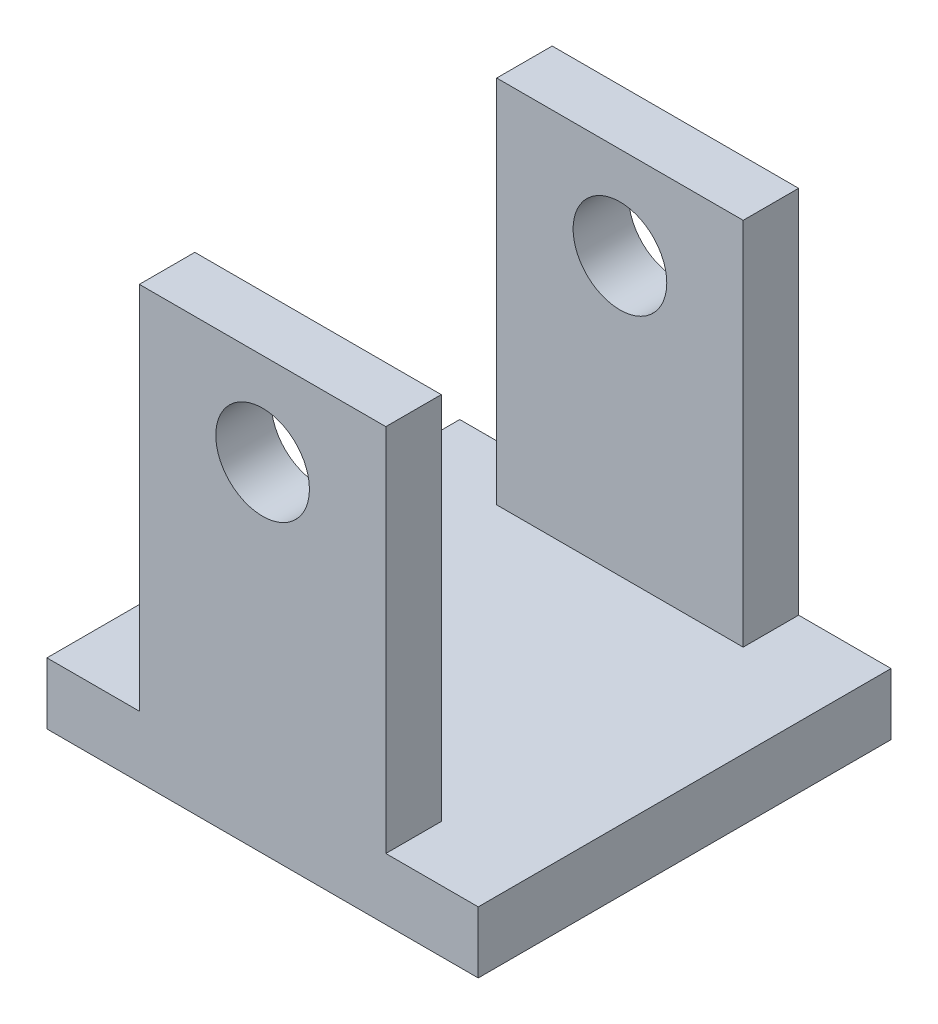
ISO-10303-21;
HEADER;
FILE_DESCRIPTION(('STEP AP214'),'2;1');
FILE_NAME('part.step','',(''),(''),'','','');
FILE_SCHEMA(('AUTOMOTIVE_DESIGN { 1 0 10303 214 1 1 1 1 }'));
ENDSEC;
DATA;
#1=APPLICATION_CONTEXT('core data for automotive mechanical design processes');
#2=APPLICATION_PROTOCOL_DEFINITION('international standard','automotive_design',2000,#1);
#3=PRODUCT_CONTEXT('',#1,'mechanical');
#4=PRODUCT('Part','Part','',(#3));
#5=PRODUCT_RELATED_PRODUCT_CATEGORY('part','',(#4));
#6=PRODUCT_DEFINITION_FORMATION('','',#4);
#7=PRODUCT_DEFINITION_CONTEXT('part definition',#1,'design');
#8=PRODUCT_DEFINITION('design','',#6,#7);
#9=PRODUCT_DEFINITION_SHAPE('','',#8);
#10=(LENGTH_UNIT() NAMED_UNIT(*) SI_UNIT(.MILLI.,.METRE.));
#11=(NAMED_UNIT(*) PLANE_ANGLE_UNIT() SI_UNIT($,.RADIAN.));
#12=(NAMED_UNIT(*) SI_UNIT($,.STERADIAN.) SOLID_ANGLE_UNIT());
#13=UNCERTAINTY_MEASURE_WITH_UNIT(LENGTH_MEASURE(1.E-05),#10,'distance_accuracy_value','');
#14=(GEOMETRIC_REPRESENTATION_CONTEXT(3) GLOBAL_UNCERTAINTY_ASSIGNED_CONTEXT((#13)) GLOBAL_UNIT_ASSIGNED_CONTEXT((#10,
#11,#12)) REPRESENTATION_CONTEXT('',''));
#15=CARTESIAN_POINT('',(0.,0.,0.));
#16=DIRECTION('',(0.,0.,1.));
#17=DIRECTION('',(1.,0.,0.));
#18=AXIS2_PLACEMENT_3D('',#15,#16,#17);
#19=CARTESIAN_POINT('',(-20.,15.,33.5));
#20=DIRECTION('',(1.,0.,0.));
#21=DIRECTION('',(0.,1.,0.));
#22=AXIS2_PLACEMENT_3D('',#19,#20,#21);
#23=PLANE('',#22);
#24=DIRECTION('',(0.,-1.,0.));
#25=VECTOR('',#24,1.);
#26=CARTESIAN_POINT('',(-20.,15.,-24.5));
#27=LINE('',#26,#25);
#28=CARTESIAN_POINT('',(-20.,15.,-24.5));
#29=VERTEX_POINT('',#28);
#30=CARTESIAN_POINT('',(-20.,-45.,-24.5));
#31=VERTEX_POINT('',#30);
#32=EDGE_CURVE('E142',#29,#31,#27,.T.);
#33=ORIENTED_EDGE('',*,*,#32,.F.);
#34=DIRECTION('',(0.,0.,-1.));
#35=VECTOR('',#34,1.);
#36=CARTESIAN_POINT('',(-20.,15.,33.5));
#37=LINE('',#36,#35);
#38=CARTESIAN_POINT('',(-20.,15.,-33.5));
#39=VERTEX_POINT('',#38);
#40=EDGE_CURVE('E269',#29,#39,#37,.T.);
#41=ORIENTED_EDGE('',*,*,#40,.T.);
#42=DIRECTION('',(0.,-1.,0.));
#43=VECTOR('',#42,1.);
#44=CARTESIAN_POINT('',(-20.,15.,-33.5));
#45=LINE('',#44,#43);
#46=CARTESIAN_POINT('',(-20.,-45.,-33.5));
#47=VERTEX_POINT('',#46);
#48=EDGE_CURVE('E154',#39,#47,#45,.T.);
#49=ORIENTED_EDGE('',*,*,#48,.T.);
#50=DIRECTION('',(0.,0.,-1.));
#51=VECTOR('',#50,1.);
#52=CARTESIAN_POINT('',(-20.,-45.,33.5));
#53=LINE('',#52,#51);
#54=EDGE_CURVE('E68',#31,#47,#53,.T.);
#55=ORIENTED_EDGE('',*,*,#54,.F.);
#56=EDGE_LOOP('',(#33,#41,#49,#55));
#57=FACE_BOUND('',#56,.T.);
#58=ADVANCED_FACE('F43',(#57),#23,.F.);
#59=CARTESIAN_POINT('',(20.,15.,33.5));
#60=DIRECTION('',(-1.,0.,0.));
#61=DIRECTION('',(0.,-1.,0.));
#62=AXIS2_PLACEMENT_3D('',#59,#60,#61);
#63=PLANE('',#62);
#64=DIRECTION('',(0.,1.,0.));
#65=VECTOR('',#64,1.);
#66=CARTESIAN_POINT('',(20.,15.,-24.5));
#67=LINE('',#66,#65);
#68=CARTESIAN_POINT('',(20.,-45.,-24.5));
#69=VERTEX_POINT('',#68);
#70=CARTESIAN_POINT('',(20.,15.,-24.5));
#71=VERTEX_POINT('',#70);
#72=EDGE_CURVE('E141',#69,#71,#67,.T.);
#73=ORIENTED_EDGE('',*,*,#72,.F.);
#74=DIRECTION('',(0.,0.,-1.));
#75=VECTOR('',#74,1.);
#76=CARTESIAN_POINT('',(20.,-45.,33.5));
#77=LINE('',#76,#75);
#78=CARTESIAN_POINT('',(20.,-45.,-33.5));
#79=VERTEX_POINT('',#78);
#80=EDGE_CURVE('E137',#69,#79,#77,.T.);
#81=ORIENTED_EDGE('',*,*,#80,.T.);
#82=DIRECTION('',(0.,1.,0.));
#83=VECTOR('',#82,1.);
#84=CARTESIAN_POINT('',(20.,15.,-33.5));
#85=LINE('',#84,#83);
#86=CARTESIAN_POINT('',(20.,15.,-33.5));
#87=VERTEX_POINT('',#86);
#88=EDGE_CURVE('E220',#79,#87,#85,.T.);
#89=ORIENTED_EDGE('',*,*,#88,.T.);
#90=DIRECTION('',(0.,0.,-1.));
#91=VECTOR('',#90,1.);
#92=CARTESIAN_POINT('',(20.,15.,33.5));
#93=LINE('',#92,#91);
#94=EDGE_CURVE('E278',#71,#87,#93,.T.);
#95=ORIENTED_EDGE('',*,*,#94,.F.);
#96=EDGE_LOOP('',(#73,#81,#89,#95));
#97=FACE_BOUND('',#96,.T.);
#98=ADVANCED_FACE('F290',(#97),#63,.F.);
#99=CARTESIAN_POINT('',(-20.,15.,33.5));
#100=DIRECTION('',(0.,-1.,0.));
#101=DIRECTION('',(1.,0.,0.));
#102=AXIS2_PLACEMENT_3D('',#99,#100,#101);
#103=PLANE('',#102);
#104=DIRECTION('',(-1.,0.,0.));
#105=VECTOR('',#104,1.);
#106=CARTESIAN_POINT('',(-20.,15.,-24.5));
#107=LINE('',#106,#105);
#108=EDGE_CURVE('E147',#71,#29,#107,.T.);
#109=ORIENTED_EDGE('',*,*,#108,.F.);
#110=ORIENTED_EDGE('',*,*,#94,.T.);
#111=DIRECTION('',(-1.,0.,0.));
#112=VECTOR('',#111,1.);
#113=CARTESIAN_POINT('',(-20.,15.,-33.5));
#114=LINE('',#113,#112);
#115=EDGE_CURVE('E263',#87,#39,#114,.T.);
#116=ORIENTED_EDGE('',*,*,#115,.T.);
#117=ORIENTED_EDGE('',*,*,#40,.F.);
#118=EDGE_LOOP('',(#109,#110,#116,#117));
#119=FACE_BOUND('',#118,.T.);
#120=ADVANCED_FACE('F288',(#119),#103,.F.);
#121=CARTESIAN_POINT('',(-35.,-45.,33.5));
#122=DIRECTION('',(1.,0.,0.));
#123=DIRECTION('',(0.,1.,0.));
#124=AXIS2_PLACEMENT_3D('',#121,#122,#123);
#125=PLANE('',#124);
#126=DIRECTION('',(0.,-1.,0.));
#127=VECTOR('',#126,1.);
#128=CARTESIAN_POINT('',(-35.,-45.,-33.5));
#129=LINE('',#128,#127);
#130=CARTESIAN_POINT('',(-35.,-45.,-33.5));
#131=VERTEX_POINT('',#130);
#132=CARTESIAN_POINT('',(-35.,-55.,-33.5));
#133=VERTEX_POINT('',#132);
#134=EDGE_CURVE('E163',#131,#133,#129,.T.);
#135=ORIENTED_EDGE('',*,*,#134,.T.);
#136=DIRECTION('',(0.,0.,-1.));
#137=VECTOR('',#136,1.);
#138=CARTESIAN_POINT('',(-35.,-55.,33.5));
#139=LINE('',#138,#137);
#140=CARTESIAN_POINT('',(-35.,-55.,33.5));
#141=VERTEX_POINT('',#140);
#142=EDGE_CURVE('E11',#141,#133,#139,.T.);
#143=ORIENTED_EDGE('',*,*,#142,.F.);
#144=DIRECTION('',(0.,-1.,0.));
#145=VECTOR('',#144,1.);
#146=CARTESIAN_POINT('',(-35.,-45.,33.5));
#147=LINE('',#146,#145);
#148=CARTESIAN_POINT('',(-35.,-45.,33.5));
#149=VERTEX_POINT('',#148);
#150=EDGE_CURVE('E168',#149,#141,#147,.T.);
#151=ORIENTED_EDGE('',*,*,#150,.F.);
#152=DIRECTION('',(0.,0.,-1.));
#153=VECTOR('',#152,1.);
#154=CARTESIAN_POINT('',(-35.,-45.,33.5));
#155=LINE('',#154,#153);
#156=EDGE_CURVE('E184',#149,#131,#155,.T.);
#157=ORIENTED_EDGE('',*,*,#156,.T.);
#158=EDGE_LOOP('',(#135,#143,#151,#157));
#159=FACE_BOUND('',#158,.T.);
#160=ADVANCED_FACE('F45',(#159),#125,.F.);
#161=CARTESIAN_POINT('',(-35.,-55.,33.5));
#162=DIRECTION('',(0.,1.,0.));
#163=DIRECTION('',(-1.,0.,0.));
#164=AXIS2_PLACEMENT_3D('',#161,#162,#163);
#165=PLANE('',#164);
#166=DIRECTION('',(1.,0.,0.));
#167=VECTOR('',#166,1.);
#168=CARTESIAN_POINT('',(-35.,-55.,-33.5));
#169=LINE('',#168,#167);
#170=CARTESIAN_POINT('',(35.,-55.,-33.5));
#171=VERTEX_POINT('',#170);
#172=EDGE_CURVE('E188',#133,#171,#169,.T.);
#173=ORIENTED_EDGE('',*,*,#172,.T.);
#174=DIRECTION('',(0.,0.,-1.));
#175=VECTOR('',#174,1.);
#176=CARTESIAN_POINT('',(35.,-55.,33.5));
#177=LINE('',#176,#175);
#178=CARTESIAN_POINT('',(35.,-55.,33.5));
#179=VERTEX_POINT('',#178);
#180=EDGE_CURVE('E53',#179,#171,#177,.T.);
#181=ORIENTED_EDGE('',*,*,#180,.F.);
#182=DIRECTION('',(1.,0.,0.));
#183=VECTOR('',#182,1.);
#184=CARTESIAN_POINT('',(-35.,-55.,33.5));
#185=LINE('',#184,#183);
#186=EDGE_CURVE('E172',#141,#179,#185,.T.);
#187=ORIENTED_EDGE('',*,*,#186,.F.);
#188=ORIENTED_EDGE('',*,*,#142,.T.);
#189=EDGE_LOOP('',(#173,#181,#187,#188));
#190=FACE_BOUND('',#189,.T.);
#191=ADVANCED_FACE('F230',(#190),#165,.F.);
#192=CARTESIAN_POINT('',(35.,-45.,33.5));
#193=DIRECTION('',(-1.,0.,0.));
#194=DIRECTION('',(0.,0.,1.));
#195=AXIS2_PLACEMENT_3D('',#192,#193,#194);
#196=PLANE('',#195);
#197=DIRECTION('',(0.,1.,0.));
#198=VECTOR('',#197,1.);
#199=CARTESIAN_POINT('',(35.,-45.,-33.5));
#200=LINE('',#199,#198);
#201=CARTESIAN_POINT('',(35.,-45.,-33.5));
#202=VERTEX_POINT('',#201);
#203=EDGE_CURVE('E191',#171,#202,#200,.T.);
#204=ORIENTED_EDGE('',*,*,#203,.T.);
#205=DIRECTION('',(0.,0.,-1.));
#206=VECTOR('',#205,1.);
#207=CARTESIAN_POINT('',(35.,-45.,33.5));
#208=LINE('',#207,#206);
#209=CARTESIAN_POINT('',(35.,-45.,33.5));
#210=VERTEX_POINT('',#209);
#211=EDGE_CURVE('E200',#210,#202,#208,.T.);
#212=ORIENTED_EDGE('',*,*,#211,.F.);
#213=DIRECTION('',(0.,1.,0.));
#214=VECTOR('',#213,1.);
#215=CARTESIAN_POINT('',(35.,-45.,33.5));
#216=LINE('',#215,#214);
#217=EDGE_CURVE('E176',#179,#210,#216,.T.);
#218=ORIENTED_EDGE('',*,*,#217,.F.);
#219=ORIENTED_EDGE('',*,*,#180,.T.);
#220=EDGE_LOOP('',(#204,#212,#218,#219));
#221=FACE_BOUND('',#220,.T.);
#222=ADVANCED_FACE('F210',(#221),#196,.F.);
#223=CARTESIAN_POINT('',(-35.,-45.,33.5));
#224=DIRECTION('',(0.,-1.,0.));
#225=DIRECTION('',(1.,0.,0.));
#226=AXIS2_PLACEMENT_3D('',#223,#224,#225);
#227=PLANE('',#226);
#228=DIRECTION('',(-1.,0.,0.));
#229=VECTOR('',#228,1.);
#230=CARTESIAN_POINT('',(-35.,-45.,33.5));
#231=LINE('',#230,#229);
#232=CARTESIAN_POINT('',(-20.,-45.,33.5));
#233=VERTEX_POINT('',#232);
#234=EDGE_CURVE('E179',#233,#149,#231,.T.);
#235=ORIENTED_EDGE('',*,*,#234,.F.);
#236=CARTESIAN_POINT('',(-20.,-45.,24.5));
#237=VERTEX_POINT('',#236);
#238=EDGE_CURVE('E157',#233,#237,#53,.T.);
#239=ORIENTED_EDGE('',*,*,#238,.T.);
#240=DIRECTION('',(1.,0.,0.));
#241=VECTOR('',#240,1.);
#242=CARTESIAN_POINT('',(-20.,-45.,24.5));
#243=LINE('',#242,#241);
#244=CARTESIAN_POINT('',(20.,-45.,24.5));
#245=VERTEX_POINT('',#244);
#246=EDGE_CURVE('E238',#237,#245,#243,.T.);
#247=ORIENTED_EDGE('',*,*,#246,.T.);
#248=CARTESIAN_POINT('',(20.,-45.,33.5));
#249=VERTEX_POINT('',#248);
#250=EDGE_CURVE('E158',#249,#245,#77,.T.);
#251=ORIENTED_EDGE('',*,*,#250,.F.);
#252=EDGE_CURVE('E180',#210,#249,#231,.T.);
#253=ORIENTED_EDGE('',*,*,#252,.F.);
#254=ORIENTED_EDGE('',*,*,#211,.T.);
#255=DIRECTION('',(-1.,0.,0.));
#256=VECTOR('',#255,1.);
#257=CARTESIAN_POINT('',(-35.,-45.,-33.5));
#258=LINE('',#257,#256);
#259=EDGE_CURVE('E173',#202,#79,#258,.T.);
#260=ORIENTED_EDGE('',*,*,#259,.T.);
#261=ORIENTED_EDGE('',*,*,#80,.F.);
#262=DIRECTION('',(1.,0.,0.));
#263=VECTOR('',#262,1.);
#264=CARTESIAN_POINT('',(-20.,-45.,-24.5));
#265=LINE('',#264,#263);
#266=EDGE_CURVE('E132',#31,#69,#265,.T.);
#267=ORIENTED_EDGE('',*,*,#266,.F.);
#268=ORIENTED_EDGE('',*,*,#54,.T.);
#269=EDGE_CURVE('E194',#47,#131,#258,.T.);
#270=ORIENTED_EDGE('',*,*,#269,.T.);
#271=ORIENTED_EDGE('',*,*,#156,.F.);
#272=EDGE_LOOP('',(#235,#239,#247,#251,#253,#254,#260,#261,#267,#268,#270,#271));
#273=FACE_BOUND('',#272,.T.);
#274=ADVANCED_FACE('F135',(#273),#227,.F.);
#275=CARTESIAN_POINT('',(0.,0.,33.5));
#276=DIRECTION('',(0.,0.,1.));
#277=DIRECTION('',(1.,0.,0.));
#278=AXIS2_PLACEMENT_3D('',#275,#276,#277);
#279=PLANE('',#278);
#280=CARTESIAN_POINT('',(0.,0.,33.5));
#281=DIRECTION('',(0.,0.,1.));
#282=DIRECTION('',(1.,0.,0.));
#283=AXIS2_PLACEMENT_3D('',#280,#281,#282);
#284=CIRCLE('',#283,7.6);
#285=CARTESIAN_POINT('',(7.6,0.,33.5));
#286=VERTEX_POINT('',#285);
#287=EDGE_CURVE('E298',#286,#286,#284,.T.);
#288=ORIENTED_EDGE('',*,*,#287,.F.);
#289=EDGE_LOOP('',(#288));
#290=FACE_BOUND('',#289,.T.);
#291=ORIENTED_EDGE('',*,*,#150,.T.);
#292=ORIENTED_EDGE('',*,*,#186,.T.);
#293=ORIENTED_EDGE('',*,*,#217,.T.);
#294=ORIENTED_EDGE('',*,*,#252,.T.);
#295=DIRECTION('',(0.,1.,0.));
#296=VECTOR('',#295,1.);
#297=CARTESIAN_POINT('',(20.,15.,33.5));
#298=LINE('',#297,#296);
#299=CARTESIAN_POINT('',(20.,15.,33.5));
#300=VERTEX_POINT('',#299);
#301=EDGE_CURVE('E226',#249,#300,#298,.T.);
#302=ORIENTED_EDGE('',*,*,#301,.T.);
#303=DIRECTION('',(-1.,0.,0.));
#304=VECTOR('',#303,1.);
#305=CARTESIAN_POINT('',(-20.,15.,33.5));
#306=LINE('',#305,#304);
#307=CARTESIAN_POINT('',(-20.,15.,33.5));
#308=VERTEX_POINT('',#307);
#309=EDGE_CURVE('E266',#300,#308,#306,.T.);
#310=ORIENTED_EDGE('',*,*,#309,.T.);
#311=DIRECTION('',(0.,-1.,0.));
#312=VECTOR('',#311,1.);
#313=CARTESIAN_POINT('',(-20.,15.,33.5));
#314=LINE('',#313,#312);
#315=EDGE_CURVE('E236',#308,#233,#314,.T.);
#316=ORIENTED_EDGE('',*,*,#315,.T.);
#317=ORIENTED_EDGE('',*,*,#234,.T.);
#318=EDGE_LOOP('',(#291,#292,#293,#294,#302,#310,#316,#317));
#319=FACE_BOUND('',#318,.T.);
#320=ADVANCED_FACE('F225',(#290,#319),#279,.T.);
#321=CARTESIAN_POINT('',(0.,0.,-33.5));
#322=DIRECTION('',(0.,0.,1.));
#323=DIRECTION('',(1.,0.,0.));
#324=AXIS2_PLACEMENT_3D('',#321,#322,#323);
#325=PLANE('',#324);
#326=CARTESIAN_POINT('',(0.,0.,-33.5));
#327=DIRECTION('',(0.,0.,1.));
#328=DIRECTION('',(1.,0.,0.));
#329=AXIS2_PLACEMENT_3D('',#326,#327,#328);
#330=CIRCLE('',#329,7.6);
#331=CARTESIAN_POINT('',(7.6,0.,-33.5));
#332=VERTEX_POINT('',#331);
#333=EDGE_CURVE('E294',#332,#332,#330,.T.);
#334=ORIENTED_EDGE('',*,*,#333,.T.);
#335=EDGE_LOOP('',(#334));
#336=FACE_BOUND('',#335,.T.);
#337=ORIENTED_EDGE('',*,*,#134,.F.);
#338=ORIENTED_EDGE('',*,*,#269,.F.);
#339=ORIENTED_EDGE('',*,*,#48,.F.);
#340=ORIENTED_EDGE('',*,*,#115,.F.);
#341=ORIENTED_EDGE('',*,*,#88,.F.);
#342=ORIENTED_EDGE('',*,*,#259,.F.);
#343=ORIENTED_EDGE('',*,*,#203,.F.);
#344=ORIENTED_EDGE('',*,*,#172,.F.);
#345=EDGE_LOOP('',(#337,#338,#339,#340,#341,#342,#343,#344));
#346=FACE_BOUND('',#345,.T.);
#347=ADVANCED_FACE('F216',(#336,#346),#325,.F.);
#348=CARTESIAN_POINT('',(-20.,15.,24.5));
#349=VERTEX_POINT('',#348);
#350=EDGE_CURVE('E243',#308,#349,#37,.T.);
#351=ORIENTED_EDGE('',*,*,#350,.T.);
#352=DIRECTION('',(0.,-1.,0.));
#353=VECTOR('',#352,1.);
#354=CARTESIAN_POINT('',(-20.,15.,24.5));
#355=LINE('',#354,#353);
#356=EDGE_CURVE('E60',#349,#237,#355,.T.);
#357=ORIENTED_EDGE('',*,*,#356,.T.);
#358=ORIENTED_EDGE('',*,*,#238,.F.);
#359=ORIENTED_EDGE('',*,*,#315,.F.);
#360=EDGE_LOOP('',(#351,#357,#358,#359));
#361=FACE_BOUND('',#360,.T.);
#362=ADVANCED_FACE('F241',(#361),#23,.F.);
#363=ORIENTED_EDGE('',*,*,#250,.T.);
#364=DIRECTION('',(0.,1.,0.));
#365=VECTOR('',#364,1.);
#366=CARTESIAN_POINT('',(20.,15.,24.5));
#367=LINE('',#366,#365);
#368=CARTESIAN_POINT('',(20.,15.,24.5));
#369=VERTEX_POINT('',#368);
#370=EDGE_CURVE('E249',#245,#369,#367,.T.);
#371=ORIENTED_EDGE('',*,*,#370,.T.);
#372=EDGE_CURVE('E279',#300,#369,#93,.T.);
#373=ORIENTED_EDGE('',*,*,#372,.F.);
#374=ORIENTED_EDGE('',*,*,#301,.F.);
#375=EDGE_LOOP('',(#363,#371,#373,#374));
#376=FACE_BOUND('',#375,.T.);
#377=ADVANCED_FACE('F321',(#376),#63,.F.);
#378=ORIENTED_EDGE('',*,*,#372,.T.);
#379=DIRECTION('',(-1.,0.,0.));
#380=VECTOR('',#379,1.);
#381=CARTESIAN_POINT('',(-20.,15.,24.5));
#382=LINE('',#381,#380);
#383=EDGE_CURVE('E151',#369,#349,#382,.T.);
#384=ORIENTED_EDGE('',*,*,#383,.T.);
#385=ORIENTED_EDGE('',*,*,#350,.F.);
#386=ORIENTED_EDGE('',*,*,#309,.F.);
#387=EDGE_LOOP('',(#378,#384,#385,#386));
#388=FACE_BOUND('',#387,.T.);
#389=ADVANCED_FACE('F326',(#388),#103,.F.);
#390=CARTESIAN_POINT('',(0.,0.,-24.5));
#391=DIRECTION('',(0.,0.,1.));
#392=DIRECTION('',(1.,0.,0.));
#393=AXIS2_PLACEMENT_3D('',#390,#391,#392);
#394=PLANE('',#393);
#395=CARTESIAN_POINT('',(0.,0.,-24.5));
#396=DIRECTION('',(0.,0.,1.));
#397=DIRECTION('',(1.,0.,0.));
#398=AXIS2_PLACEMENT_3D('',#395,#396,#397);
#399=CIRCLE('',#398,7.6);
#400=CARTESIAN_POINT('',(7.6,0.,-24.5));
#401=VERTEX_POINT('',#400);
#402=EDGE_CURVE('E245',#401,#401,#399,.T.);
#403=ORIENTED_EDGE('',*,*,#402,.F.);
#404=EDGE_LOOP('',(#403));
#405=FACE_BOUND('',#404,.T.);
#406=ORIENTED_EDGE('',*,*,#32,.T.);
#407=ORIENTED_EDGE('',*,*,#266,.T.);
#408=ORIENTED_EDGE('',*,*,#72,.T.);
#409=ORIENTED_EDGE('',*,*,#108,.T.);
#410=EDGE_LOOP('',(#406,#407,#408,#409));
#411=FACE_BOUND('',#410,.T.);
#412=ADVANCED_FACE('F145',(#405,#411),#394,.T.);
#413=CARTESIAN_POINT('',(0.,0.,24.5));
#414=DIRECTION('',(0.,0.,1.));
#415=DIRECTION('',(1.,0.,0.));
#416=AXIS2_PLACEMENT_3D('',#413,#414,#415);
#417=PLANE('',#416);
#418=CARTESIAN_POINT('',(0.,0.,24.5));
#419=DIRECTION('',(0.,0.,1.));
#420=DIRECTION('',(1.,0.,0.));
#421=AXIS2_PLACEMENT_3D('',#418,#419,#420);
#422=CIRCLE('',#421,7.6);
#423=CARTESIAN_POINT('',(7.6,0.,24.5));
#424=VERTEX_POINT('',#423);
#425=EDGE_CURVE('E47',#424,#424,#422,.T.);
#426=ORIENTED_EDGE('',*,*,#425,.T.);
#427=EDGE_LOOP('',(#426));
#428=FACE_BOUND('',#427,.T.);
#429=ORIENTED_EDGE('',*,*,#356,.F.);
#430=ORIENTED_EDGE('',*,*,#383,.F.);
#431=ORIENTED_EDGE('',*,*,#370,.F.);
#432=ORIENTED_EDGE('',*,*,#246,.F.);
#433=EDGE_LOOP('',(#429,#430,#431,#432));
#434=FACE_BOUND('',#433,.T.);
#435=ADVANCED_FACE('F333',(#428,#434),#417,.F.);
#436=CARTESIAN_POINT('',(0.,0.,-33.5));
#437=DIRECTION('',(0.,0.,1.));
#438=DIRECTION('',(1.,0.,0.));
#439=AXIS2_PLACEMENT_3D('',#436,#437,#438);
#440=CYLINDRICAL_SURFACE('',#439,7.6);
#441=ORIENTED_EDGE('',*,*,#287,.T.);
#442=EDGE_LOOP('',(#441));
#443=FACE_BOUND('',#442,.T.);
#444=ORIENTED_EDGE('',*,*,#425,.F.);
#445=EDGE_LOOP('',(#444));
#446=FACE_BOUND('',#445,.T.);
#447=ADVANCED_FACE('F303',(#443,#446),#440,.F.);
#448=ORIENTED_EDGE('',*,*,#402,.T.);
#449=EDGE_LOOP('',(#448));
#450=FACE_BOUND('',#449,.T.);
#451=ORIENTED_EDGE('',*,*,#333,.F.);
#452=EDGE_LOOP('',(#451));
#453=FACE_BOUND('',#452,.T.);
#454=ADVANCED_FACE('F340',(#450,#453),#440,.F.);
#455=CLOSED_SHELL('',(#58,#98,#120,#160,#191,#222,#274,#320,#347,#362,#377,#389,#412,#435,#447,#454));
#456=MANIFOLD_SOLID_BREP('B2',#455);
#457=ADVANCED_BREP_SHAPE_REPRESENTATION('',(#18,#456),#14);
#458=SHAPE_DEFINITION_REPRESENTATION(#9,#457);
ENDSEC;
END-ISO-10303-21;
